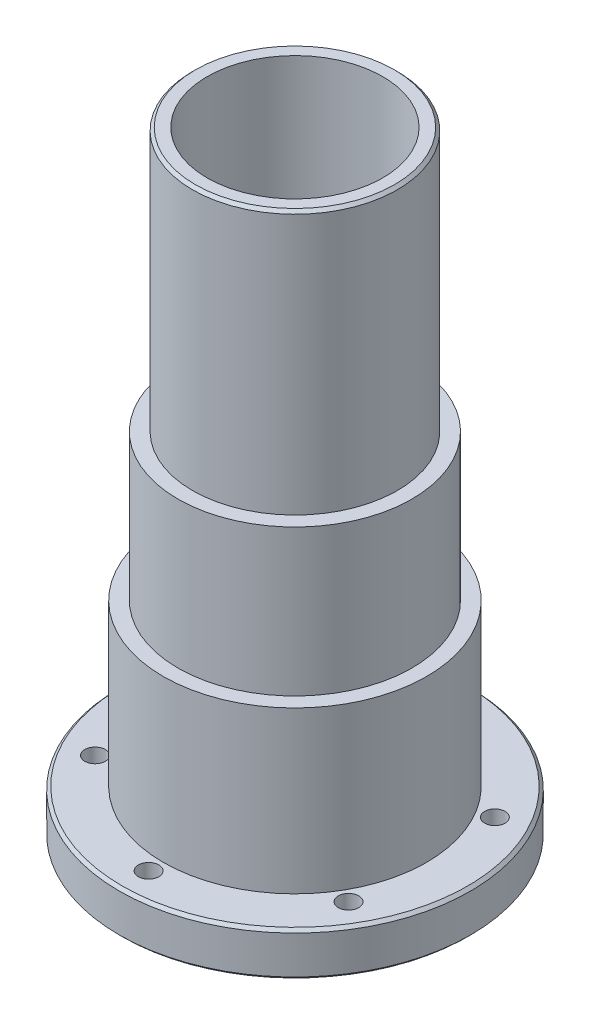
ISO-10303-21;
HEADER;
FILE_DESCRIPTION(('STEP AP214'),'2;1');
FILE_NAME('part.step','',(''),(''),'','','');
FILE_SCHEMA(('AUTOMOTIVE_DESIGN { 1 0 10303 214 1 1 1 1 }'));
ENDSEC;
DATA;
#1=APPLICATION_CONTEXT('core data for automotive mechanical design processes');
#2=APPLICATION_PROTOCOL_DEFINITION('international standard','automotive_design',2000,#1);
#3=PRODUCT_CONTEXT('',#1,'mechanical');
#4=PRODUCT('Part','Part','',(#3));
#5=PRODUCT_RELATED_PRODUCT_CATEGORY('part','',(#4));
#6=PRODUCT_DEFINITION_FORMATION('','',#4);
#7=PRODUCT_DEFINITION_CONTEXT('part definition',#1,'design');
#8=PRODUCT_DEFINITION('design','',#6,#7);
#9=PRODUCT_DEFINITION_SHAPE('','',#8);
#10=(LENGTH_UNIT() NAMED_UNIT(*) SI_UNIT(.MILLI.,.METRE.));
#11=(NAMED_UNIT(*) PLANE_ANGLE_UNIT() SI_UNIT($,.RADIAN.));
#12=(NAMED_UNIT(*) SI_UNIT($,.STERADIAN.) SOLID_ANGLE_UNIT());
#13=UNCERTAINTY_MEASURE_WITH_UNIT(LENGTH_MEASURE(1.E-05),#10,'distance_accuracy_value','');
#14=(GEOMETRIC_REPRESENTATION_CONTEXT(3) GLOBAL_UNCERTAINTY_ASSIGNED_CONTEXT((#13)) GLOBAL_UNIT_ASSIGNED_CONTEXT((#10,
#11,#12)) REPRESENTATION_CONTEXT('',''));
#15=CARTESIAN_POINT('',(0.,0.,0.));
#16=DIRECTION('',(0.,0.,1.));
#17=DIRECTION('',(1.,0.,0.));
#18=AXIS2_PLACEMENT_3D('',#15,#16,#17);
#19=CARTESIAN_POINT('',(0.,105.,17.5));
#20=DIRECTION('',(0.,1.,0.));
#21=DIRECTION('',(0.,0.,1.));
#22=AXIS2_PLACEMENT_3D('',#19,#20,#21);
#23=PLANE('',#22);
#24=CARTESIAN_POINT('',(0.,105.,0.));
#25=DIRECTION('',(0.,1.,0.));
#26=DIRECTION('',(0.,0.,1.));
#27=AXIS2_PLACEMENT_3D('',#24,#25,#26);
#28=CIRCLE('',#27,17.);
#29=CARTESIAN_POINT('',(0.,105.,17.));
#30=VERTEX_POINT('',#29);
#31=EDGE_CURVE('E44',#30,#30,#28,.T.);
#32=ORIENTED_EDGE('',*,*,#31,.T.);
#33=EDGE_LOOP('',(#32));
#34=FACE_BOUND('',#33,.T.);
#35=CARTESIAN_POINT('',(0.,105.,0.));
#36=DIRECTION('',(0.,1.,0.));
#37=DIRECTION('',(0.,0.,1.));
#38=AXIS2_PLACEMENT_3D('',#35,#36,#37);
#39=CIRCLE('',#38,15.);
#40=CARTESIAN_POINT('',(0.,105.,15.));
#41=VERTEX_POINT('',#40);
#42=EDGE_CURVE('E63',#41,#41,#39,.T.);
#43=ORIENTED_EDGE('',*,*,#42,.F.);
#44=EDGE_LOOP('',(#43));
#45=FACE_BOUND('',#44,.T.);
#46=ADVANCED_FACE('F36',(#34,#45),#23,.T.);
#47=CARTESIAN_POINT('',(0.,44.,0.));
#48=DIRECTION('',(0.,1.,0.));
#49=DIRECTION('',(0.,0.,1.));
#50=AXIS2_PLACEMENT_3D('',#47,#48,#49);
#51=CYLINDRICAL_SURFACE('',#50,15.);
#52=ORIENTED_EDGE('',*,*,#42,.T.);
#53=EDGE_LOOP('',(#52));
#54=FACE_BOUND('',#53,.T.);
#55=CARTESIAN_POINT('',(0.,0.,0.));
#56=DIRECTION('',(0.,1.,0.));
#57=DIRECTION('',(0.,0.,1.));
#58=AXIS2_PLACEMENT_3D('',#55,#56,#57);
#59=CIRCLE('',#58,15.);
#60=CARTESIAN_POINT('',(0.,0.,15.));
#61=VERTEX_POINT('',#60);
#62=EDGE_CURVE('E96',#61,#61,#59,.T.);
#63=ORIENTED_EDGE('',*,*,#62,.F.);
#64=EDGE_LOOP('',(#63));
#65=FACE_BOUND('',#64,.T.);
#66=ADVANCED_FACE('F163',(#54,#65),#51,.F.);
#67=CARTESIAN_POINT('',(0.,0.,15.));
#68=DIRECTION('',(0.,-1.,0.));
#69=DIRECTION('',(0.,0.,-1.));
#70=AXIS2_PLACEMENT_3D('',#67,#68,#69);
#71=PLANE('',#70);
#72=CARTESIAN_POINT('',(0.,0.,0.));
#73=DIRECTION('',(0.,-1.,0.));
#74=DIRECTION('',(0.,0.,-1.));
#75=AXIS2_PLACEMENT_3D('',#72,#73,#74);
#76=CIRCLE('',#75,29.5);
#77=CARTESIAN_POINT('',(0.,0.,-29.5));
#78=VERTEX_POINT('',#77);
#79=EDGE_CURVE('E48',#78,#78,#76,.T.);
#80=ORIENTED_EDGE('',*,*,#79,.T.);
#81=EDGE_LOOP('',(#80));
#82=FACE_BOUND('',#81,.T.);
#83=CARTESIAN_POINT('',(-21.6506350946108,0.,12.5000000000003));
#84=DIRECTION('',(0.,-1.,0.));
#85=DIRECTION('',(0.,0.,-1.));
#86=AXIS2_PLACEMENT_3D('',#83,#84,#85);
#87=CIRCLE('',#86,3.);
#88=CARTESIAN_POINT('',(-21.6506350946108,0.,9.50000000000025));
#89=VERTEX_POINT('',#88);
#90=EDGE_CURVE('E153',#89,#89,#87,.T.);
#91=ORIENTED_EDGE('',*,*,#90,.F.);
#92=EDGE_LOOP('',(#91));
#93=FACE_BOUND('',#92,.T.);
#94=CARTESIAN_POINT('',(-21.6506350946111,0.,-12.4999999999998));
#95=DIRECTION('',(0.,-1.,0.));
#96=DIRECTION('',(0.,0.,-1.));
#97=AXIS2_PLACEMENT_3D('',#94,#95,#96);
#98=CIRCLE('',#97,3.);
#99=CARTESIAN_POINT('',(-21.6506350946111,0.,-15.4999999999998));
#100=VERTEX_POINT('',#99);
#101=EDGE_CURVE('E67',#100,#100,#98,.T.);
#102=ORIENTED_EDGE('',*,*,#101,.F.);
#103=EDGE_LOOP('',(#102));
#104=FACE_BOUND('',#103,.T.);
#105=CARTESIAN_POINT('',(0.,0.,-25.));
#106=DIRECTION('',(0.,-1.,0.));
#107=DIRECTION('',(0.,0.,-1.));
#108=AXIS2_PLACEMENT_3D('',#105,#106,#107);
#109=CIRCLE('',#108,3.);
#110=CARTESIAN_POINT('',(0.,0.,-28.));
#111=VERTEX_POINT('',#110);
#112=EDGE_CURVE('E72',#111,#111,#109,.T.);
#113=ORIENTED_EDGE('',*,*,#112,.F.);
#114=EDGE_LOOP('',(#113));
#115=FACE_BOUND('',#114,.T.);
#116=CARTESIAN_POINT('',(21.6506350946109,0.,-12.5000000000001));
#117=DIRECTION('',(0.,-1.,0.));
#118=DIRECTION('',(0.,0.,-1.));
#119=AXIS2_PLACEMENT_3D('',#116,#117,#118);
#120=CIRCLE('',#119,3.);
#121=CARTESIAN_POINT('',(21.6506350946109,0.,-15.5000000000001));
#122=VERTEX_POINT('',#121);
#123=EDGE_CURVE('E77',#122,#122,#120,.T.);
#124=ORIENTED_EDGE('',*,*,#123,.F.);
#125=EDGE_LOOP('',(#124));
#126=FACE_BOUND('',#125,.T.);
#127=CARTESIAN_POINT('',(21.650635094611,0.,12.5));
#128=DIRECTION('',(0.,-1.,0.));
#129=DIRECTION('',(0.,0.,-1.));
#130=AXIS2_PLACEMENT_3D('',#127,#128,#129);
#131=CIRCLE('',#130,3.);
#132=CARTESIAN_POINT('',(21.650635094611,0.,9.49999999999995));
#133=VERTEX_POINT('',#132);
#134=EDGE_CURVE('E82',#133,#133,#131,.T.);
#135=ORIENTED_EDGE('',*,*,#134,.F.);
#136=EDGE_LOOP('',(#135));
#137=FACE_BOUND('',#136,.T.);
#138=CARTESIAN_POINT('',(0.,0.,25.));
#139=DIRECTION('',(0.,-1.,0.));
#140=DIRECTION('',(0.,0.,-1.));
#141=AXIS2_PLACEMENT_3D('',#138,#139,#140);
#142=CIRCLE('',#141,3.);
#143=CARTESIAN_POINT('',(0.,0.,22.));
#144=VERTEX_POINT('',#143);
#145=EDGE_CURVE('E87',#144,#144,#142,.T.);
#146=ORIENTED_EDGE('',*,*,#145,.F.);
#147=EDGE_LOOP('',(#146));
#148=FACE_BOUND('',#147,.T.);
#149=ORIENTED_EDGE('',*,*,#62,.T.);
#150=EDGE_LOOP('',(#149));
#151=FACE_BOUND('',#150,.T.);
#152=ADVANCED_FACE('F159',(#82,#93,#104,#115,#126,#137,#148,#151),#71,.T.);
#153=CARTESIAN_POINT('',(0.,44.,0.));
#154=DIRECTION('',(0.,1.,0.));
#155=DIRECTION('',(0.,0.,1.));
#156=AXIS2_PLACEMENT_3D('',#153,#154,#155);
#157=CYLINDRICAL_SURFACE('',#156,30.);
#158=CARTESIAN_POINT('',(0.,7.00000000000003,0.));
#159=DIRECTION('',(0.,1.,0.));
#160=DIRECTION('',(0.,0.,1.));
#161=AXIS2_PLACEMENT_3D('',#158,#159,#160);
#162=CIRCLE('',#161,30.);
#163=CARTESIAN_POINT('',(0.,7.00000000000003,30.));
#164=VERTEX_POINT('',#163);
#165=EDGE_CURVE('E52',#164,#164,#162,.F.);
#166=ORIENTED_EDGE('',*,*,#165,.T.);
#167=EDGE_LOOP('',(#166));
#168=FACE_BOUND('',#167,.T.);
#169=CARTESIAN_POINT('',(0.,0.5,0.));
#170=DIRECTION('',(0.,-1.,0.));
#171=DIRECTION('',(0.,0.,-1.));
#172=AXIS2_PLACEMENT_3D('',#169,#170,#171);
#173=CIRCLE('',#172,30.);
#174=CARTESIAN_POINT('',(0.,0.5,-30.));
#175=VERTEX_POINT('',#174);
#176=EDGE_CURVE('E57',#175,#175,#173,.F.);
#177=ORIENTED_EDGE('',*,*,#176,.T.);
#178=EDGE_LOOP('',(#177));
#179=FACE_BOUND('',#178,.T.);
#180=ADVANCED_FACE('F162',(#168,#179),#157,.T.);
#181=CARTESIAN_POINT('',(0.,7.5,30.));
#182=DIRECTION('',(0.,1.,0.));
#183=DIRECTION('',(0.,0.,1.));
#184=AXIS2_PLACEMENT_3D('',#181,#182,#183);
#185=PLANE('',#184);
#186=CARTESIAN_POINT('',(0.,7.5,0.));
#187=DIRECTION('',(0.,1.,0.));
#188=DIRECTION('',(0.,0.,1.));
#189=AXIS2_PLACEMENT_3D('',#186,#187,#188);
#190=CIRCLE('',#189,29.5);
#191=CARTESIAN_POINT('',(0.,7.5,29.5));
#192=VERTEX_POINT('',#191);
#193=EDGE_CURVE('E60',#192,#192,#190,.T.);
#194=ORIENTED_EDGE('',*,*,#193,.T.);
#195=EDGE_LOOP('',(#194));
#196=FACE_BOUND('',#195,.T.);
#197=CARTESIAN_POINT('',(-21.6506350946108,7.5,12.5000000000003));
#198=DIRECTION('',(0.,1.,0.));
#199=DIRECTION('',(0.,0.,1.));
#200=AXIS2_PLACEMENT_3D('',#197,#198,#199);
#201=CIRCLE('',#200,1.74999999999999);
#202=CARTESIAN_POINT('',(-21.6506350946108,7.5,14.2500000000002));
#203=VERTEX_POINT('',#202);
#204=EDGE_CURVE('E64',#203,#203,#201,.T.);
#205=ORIENTED_EDGE('',*,*,#204,.F.);
#206=EDGE_LOOP('',(#205));
#207=FACE_BOUND('',#206,.T.);
#208=CARTESIAN_POINT('',(-21.6506350946111,7.5,-12.4999999999998));
#209=DIRECTION('',(0.,1.,0.));
#210=DIRECTION('',(0.,0.,1.));
#211=AXIS2_PLACEMENT_3D('',#208,#209,#210);
#212=CIRCLE('',#211,1.74999999999999);
#213=CARTESIAN_POINT('',(-21.6506350946111,7.5,-10.7499999999998));
#214=VERTEX_POINT('',#213);
#215=EDGE_CURVE('E69',#214,#214,#212,.T.);
#216=ORIENTED_EDGE('',*,*,#215,.F.);
#217=EDGE_LOOP('',(#216));
#218=FACE_BOUND('',#217,.T.);
#219=CARTESIAN_POINT('',(0.,7.5,-25.));
#220=DIRECTION('',(0.,1.,0.));
#221=DIRECTION('',(0.,0.,1.));
#222=AXIS2_PLACEMENT_3D('',#219,#220,#221);
#223=CIRCLE('',#222,1.74999999999999);
#224=CARTESIAN_POINT('',(0.,7.5,-23.25));
#225=VERTEX_POINT('',#224);
#226=EDGE_CURVE('E74',#225,#225,#223,.T.);
#227=ORIENTED_EDGE('',*,*,#226,.F.);
#228=EDGE_LOOP('',(#227));
#229=FACE_BOUND('',#228,.T.);
#230=CARTESIAN_POINT('',(21.6506350946109,7.5,-12.5000000000001));
#231=DIRECTION('',(0.,1.,0.));
#232=DIRECTION('',(0.,0.,1.));
#233=AXIS2_PLACEMENT_3D('',#230,#231,#232);
#234=CIRCLE('',#233,1.74999999999999);
#235=CARTESIAN_POINT('',(21.6506350946109,7.5,-10.7500000000001));
#236=VERTEX_POINT('',#235);
#237=EDGE_CURVE('E79',#236,#236,#234,.T.);
#238=ORIENTED_EDGE('',*,*,#237,.F.);
#239=EDGE_LOOP('',(#238));
#240=FACE_BOUND('',#239,.T.);
#241=CARTESIAN_POINT('',(21.650635094611,7.5,12.5));
#242=DIRECTION('',(0.,1.,0.));
#243=DIRECTION('',(0.,0.,1.));
#244=AXIS2_PLACEMENT_3D('',#241,#242,#243);
#245=CIRCLE('',#244,1.74999999999999);
#246=CARTESIAN_POINT('',(21.650635094611,7.5,14.2499999999999));
#247=VERTEX_POINT('',#246);
#248=EDGE_CURVE('E84',#247,#247,#245,.T.);
#249=ORIENTED_EDGE('',*,*,#248,.F.);
#250=EDGE_LOOP('',(#249));
#251=FACE_BOUND('',#250,.T.);
#252=CARTESIAN_POINT('',(0.,7.5,25.));
#253=DIRECTION('',(0.,1.,0.));
#254=DIRECTION('',(0.,0.,1.));
#255=AXIS2_PLACEMENT_3D('',#252,#253,#254);
#256=CIRCLE('',#255,1.74999999999999);
#257=CARTESIAN_POINT('',(0.,7.5,26.75));
#258=VERTEX_POINT('',#257);
#259=EDGE_CURVE('E89',#258,#258,#256,.T.);
#260=ORIENTED_EDGE('',*,*,#259,.F.);
#261=EDGE_LOOP('',(#260));
#262=FACE_BOUND('',#261,.T.);
#263=CARTESIAN_POINT('',(0.,7.5,0.));
#264=DIRECTION('',(0.,1.,0.));
#265=DIRECTION('',(0.,0.,1.));
#266=AXIS2_PLACEMENT_3D('',#263,#264,#265);
#267=CIRCLE('',#266,22.5);
#268=CARTESIAN_POINT('',(0.,7.5,22.5));
#269=VERTEX_POINT('',#268);
#270=EDGE_CURVE('E99',#269,#269,#267,.T.);
#271=ORIENTED_EDGE('',*,*,#270,.F.);
#272=EDGE_LOOP('',(#271));
#273=FACE_BOUND('',#272,.T.);
#274=ADVANCED_FACE('F208',(#196,#207,#218,#229,#240,#251,#262,#273),#185,.T.);
#275=CARTESIAN_POINT('',(0.,44.,0.));
#276=DIRECTION('',(0.,1.,0.));
#277=DIRECTION('',(0.,0.,1.));
#278=AXIS2_PLACEMENT_3D('',#275,#276,#277);
#279=CYLINDRICAL_SURFACE('',#278,22.5);
#280=ORIENTED_EDGE('',*,*,#270,.T.);
#281=EDGE_LOOP('',(#280));
#282=FACE_BOUND('',#281,.T.);
#283=CARTESIAN_POINT('',(0.,35.,0.));
#284=DIRECTION('',(0.,1.,0.));
#285=DIRECTION('',(0.,0.,1.));
#286=AXIS2_PLACEMENT_3D('',#283,#284,#285);
#287=CIRCLE('',#286,22.5);
#288=CARTESIAN_POINT('',(0.,35.,22.5));
#289=VERTEX_POINT('',#288);
#290=EDGE_CURVE('E102',#289,#289,#287,.T.);
#291=ORIENTED_EDGE('',*,*,#290,.F.);
#292=EDGE_LOOP('',(#291));
#293=FACE_BOUND('',#292,.T.);
#294=ADVANCED_FACE('F213',(#282,#293),#279,.T.);
#295=CARTESIAN_POINT('',(0.,35.,22.5));
#296=DIRECTION('',(0.,1.,0.));
#297=DIRECTION('',(0.,0.,1.));
#298=AXIS2_PLACEMENT_3D('',#295,#296,#297);
#299=PLANE('',#298);
#300=ORIENTED_EDGE('',*,*,#290,.T.);
#301=EDGE_LOOP('',(#300));
#302=FACE_BOUND('',#301,.T.);
#303=CARTESIAN_POINT('',(0.,35.,0.));
#304=DIRECTION('',(0.,1.,0.));
#305=DIRECTION('',(0.,0.,1.));
#306=AXIS2_PLACEMENT_3D('',#303,#304,#305);
#307=CIRCLE('',#306,20.);
#308=CARTESIAN_POINT('',(0.,35.,20.));
#309=VERTEX_POINT('',#308);
#310=EDGE_CURVE('E105',#309,#309,#307,.T.);
#311=ORIENTED_EDGE('',*,*,#310,.F.);
#312=EDGE_LOOP('',(#311));
#313=FACE_BOUND('',#312,.T.);
#314=ADVANCED_FACE('F219',(#302,#313),#299,.T.);
#315=CARTESIAN_POINT('',(0.,44.,0.));
#316=DIRECTION('',(0.,1.,0.));
#317=DIRECTION('',(0.,0.,1.));
#318=AXIS2_PLACEMENT_3D('',#315,#316,#317);
#319=CYLINDRICAL_SURFACE('',#318,20.);
#320=ORIENTED_EDGE('',*,*,#310,.T.);
#321=EDGE_LOOP('',(#320));
#322=FACE_BOUND('',#321,.T.);
#323=CARTESIAN_POINT('',(0.,60.,0.));
#324=DIRECTION('',(0.,1.,0.));
#325=DIRECTION('',(0.,0.,1.));
#326=AXIS2_PLACEMENT_3D('',#323,#324,#325);
#327=CIRCLE('',#326,20.);
#328=CARTESIAN_POINT('',(0.,60.,20.));
#329=VERTEX_POINT('',#328);
#330=EDGE_CURVE('E108',#329,#329,#327,.T.);
#331=ORIENTED_EDGE('',*,*,#330,.F.);
#332=EDGE_LOOP('',(#331));
#333=FACE_BOUND('',#332,.T.);
#334=ADVANCED_FACE('F223',(#322,#333),#319,.T.);
#335=CARTESIAN_POINT('',(0.,60.,20.));
#336=DIRECTION('',(0.,1.,0.));
#337=DIRECTION('',(0.,0.,1.));
#338=AXIS2_PLACEMENT_3D('',#335,#336,#337);
#339=PLANE('',#338);
#340=ORIENTED_EDGE('',*,*,#330,.T.);
#341=EDGE_LOOP('',(#340));
#342=FACE_BOUND('',#341,.T.);
#343=CARTESIAN_POINT('',(0.,60.,0.));
#344=DIRECTION('',(0.,1.,0.));
#345=DIRECTION('',(0.,0.,1.));
#346=AXIS2_PLACEMENT_3D('',#343,#344,#345);
#347=CIRCLE('',#346,17.5);
#348=CARTESIAN_POINT('',(0.,60.,17.5));
#349=VERTEX_POINT('',#348);
#350=EDGE_CURVE('E92',#349,#349,#347,.T.);
#351=ORIENTED_EDGE('',*,*,#350,.F.);
#352=EDGE_LOOP('',(#351));
#353=FACE_BOUND('',#352,.T.);
#354=ADVANCED_FACE('F227',(#342,#353),#339,.T.);
#355=CARTESIAN_POINT('',(0.,44.,0.));
#356=DIRECTION('',(0.,1.,0.));
#357=DIRECTION('',(0.,0.,1.));
#358=AXIS2_PLACEMENT_3D('',#355,#356,#357);
#359=CYLINDRICAL_SURFACE('',#358,17.5);
#360=CARTESIAN_POINT('',(0.,104.5,0.));
#361=DIRECTION('',(0.,1.,0.));
#362=DIRECTION('',(0.,0.,1.));
#363=AXIS2_PLACEMENT_3D('',#360,#361,#362);
#364=CIRCLE('',#363,17.5);
#365=CARTESIAN_POINT('',(0.,104.5,17.5));
#366=VERTEX_POINT('',#365);
#367=EDGE_CURVE('E10',#366,#366,#364,.F.);
#368=ORIENTED_EDGE('',*,*,#367,.T.);
#369=EDGE_LOOP('',(#368));
#370=FACE_BOUND('',#369,.T.);
#371=ORIENTED_EDGE('',*,*,#350,.T.);
#372=EDGE_LOOP('',(#371));
#373=FACE_BOUND('',#372,.T.);
#374=ADVANCED_FACE('F231',(#370,#373),#359,.T.);
#375=CARTESIAN_POINT('',(0.,0.,25.));
#376=DIRECTION('',(0.,-1.,0.));
#377=DIRECTION('',(0.,0.,-1.));
#378=AXIS2_PLACEMENT_3D('',#375,#376,#377);
#379=CYLINDRICAL_SURFACE('',#378,1.74999999999999);
#380=ORIENTED_EDGE('',*,*,#259,.T.);
#381=EDGE_LOOP('',(#380));
#382=FACE_BOUND('',#381,.T.);
#383=CARTESIAN_POINT('',(0.,4.,25.));
#384=DIRECTION('',(0.,-1.,0.));
#385=DIRECTION('',(0.,0.,-1.));
#386=AXIS2_PLACEMENT_3D('',#383,#384,#385);
#387=CIRCLE('',#386,1.75000000000001);
#388=CARTESIAN_POINT('',(0.,4.,23.25));
#389=VERTEX_POINT('',#388);
#390=EDGE_CURVE('E93',#389,#389,#387,.T.);
#391=ORIENTED_EDGE('',*,*,#390,.T.);
#392=EDGE_LOOP('',(#391));
#393=FACE_BOUND('',#392,.T.);
#394=ADVANCED_FACE('F235',(#382,#393),#379,.F.);
#395=CARTESIAN_POINT('',(1.75000000000001,4.,25.));
#396=DIRECTION('',(0.,1.,0.));
#397=DIRECTION('',(0.,0.,1.));
#398=AXIS2_PLACEMENT_3D('',#395,#396,#397);
#399=PLANE('',#398);
#400=ORIENTED_EDGE('',*,*,#390,.F.);
#401=EDGE_LOOP('',(#400));
#402=FACE_BOUND('',#401,.T.);
#403=CARTESIAN_POINT('',(0.,4.,25.));
#404=DIRECTION('',(0.,-1.,0.));
#405=DIRECTION('',(0.,0.,-1.));
#406=AXIS2_PLACEMENT_3D('',#403,#404,#405);
#407=CIRCLE('',#406,3.);
#408=CARTESIAN_POINT('',(0.,4.,22.));
#409=VERTEX_POINT('',#408);
#410=EDGE_CURVE('E115',#409,#409,#407,.T.);
#411=ORIENTED_EDGE('',*,*,#410,.T.);
#412=EDGE_LOOP('',(#411));
#413=FACE_BOUND('',#412,.T.);
#414=ADVANCED_FACE('F238',(#402,#413),#399,.F.);
#415=CARTESIAN_POINT('',(0.,0.,25.));
#416=DIRECTION('',(0.,-1.,0.));
#417=DIRECTION('',(0.,0.,-1.));
#418=AXIS2_PLACEMENT_3D('',#415,#416,#417);
#419=CYLINDRICAL_SURFACE('',#418,3.);
#420=ORIENTED_EDGE('',*,*,#410,.F.);
#421=EDGE_LOOP('',(#420));
#422=FACE_BOUND('',#421,.T.);
#423=ORIENTED_EDGE('',*,*,#145,.T.);
#424=EDGE_LOOP('',(#423));
#425=FACE_BOUND('',#424,.T.);
#426=ADVANCED_FACE('F242',(#422,#425),#419,.F.);
#427=CARTESIAN_POINT('',(21.650635094611,0.,12.5));
#428=DIRECTION('',(0.,-1.,0.));
#429=DIRECTION('',(0.,0.,-1.));
#430=AXIS2_PLACEMENT_3D('',#427,#428,#429);
#431=CYLINDRICAL_SURFACE('',#430,1.74999999999999);
#432=ORIENTED_EDGE('',*,*,#248,.T.);
#433=EDGE_LOOP('',(#432));
#434=FACE_BOUND('',#433,.T.);
#435=CARTESIAN_POINT('',(21.650635094611,4.,12.5));
#436=DIRECTION('',(0.,-1.,0.));
#437=DIRECTION('',(0.,0.,-1.));
#438=AXIS2_PLACEMENT_3D('',#435,#436,#437);
#439=CIRCLE('',#438,1.75000000000001);
#440=CARTESIAN_POINT('',(21.650635094611,4.,10.7499999999999));
#441=VERTEX_POINT('',#440);
#442=EDGE_CURVE('E88',#441,#441,#439,.T.);
#443=ORIENTED_EDGE('',*,*,#442,.T.);
#444=EDGE_LOOP('',(#443));
#445=FACE_BOUND('',#444,.T.);
#446=ADVANCED_FACE('F246',(#434,#445),#431,.F.);
#447=CARTESIAN_POINT('',(23.400635094611,4.,12.5));
#448=DIRECTION('',(0.,1.,0.));
#449=DIRECTION('',(0.,0.,1.));
#450=AXIS2_PLACEMENT_3D('',#447,#448,#449);
#451=PLANE('',#450);
#452=ORIENTED_EDGE('',*,*,#442,.F.);
#453=EDGE_LOOP('',(#452));
#454=FACE_BOUND('',#453,.T.);
#455=CARTESIAN_POINT('',(21.650635094611,4.,12.5));
#456=DIRECTION('',(0.,-1.,0.));
#457=DIRECTION('',(0.,0.,-1.));
#458=AXIS2_PLACEMENT_3D('',#455,#456,#457);
#459=CIRCLE('',#458,3.);
#460=CARTESIAN_POINT('',(21.650635094611,4.,9.49999999999995));
#461=VERTEX_POINT('',#460);
#462=EDGE_CURVE('E122',#461,#461,#459,.T.);
#463=ORIENTED_EDGE('',*,*,#462,.T.);
#464=EDGE_LOOP('',(#463));
#465=FACE_BOUND('',#464,.T.);
#466=ADVANCED_FACE('F250',(#454,#465),#451,.F.);
#467=CARTESIAN_POINT('',(21.650635094611,0.,12.5));
#468=DIRECTION('',(0.,-1.,0.));
#469=DIRECTION('',(0.,0.,-1.));
#470=AXIS2_PLACEMENT_3D('',#467,#468,#469);
#471=CYLINDRICAL_SURFACE('',#470,3.);
#472=ORIENTED_EDGE('',*,*,#462,.F.);
#473=EDGE_LOOP('',(#472));
#474=FACE_BOUND('',#473,.T.);
#475=ORIENTED_EDGE('',*,*,#134,.T.);
#476=EDGE_LOOP('',(#475));
#477=FACE_BOUND('',#476,.T.);
#478=ADVANCED_FACE('F254',(#474,#477),#471,.F.);
#479=CARTESIAN_POINT('',(21.6506350946109,0.,-12.5000000000001));
#480=DIRECTION('',(0.,-1.,0.));
#481=DIRECTION('',(0.,0.,-1.));
#482=AXIS2_PLACEMENT_3D('',#479,#480,#481);
#483=CYLINDRICAL_SURFACE('',#482,1.74999999999999);
#484=ORIENTED_EDGE('',*,*,#237,.T.);
#485=EDGE_LOOP('',(#484));
#486=FACE_BOUND('',#485,.T.);
#487=CARTESIAN_POINT('',(21.6506350946109,4.,-12.5000000000001));
#488=DIRECTION('',(0.,-1.,0.));
#489=DIRECTION('',(0.,0.,-1.));
#490=AXIS2_PLACEMENT_3D('',#487,#488,#489);
#491=CIRCLE('',#490,1.75000000000001);
#492=CARTESIAN_POINT('',(21.6506350946109,4.,-14.2500000000001));
#493=VERTEX_POINT('',#492);
#494=EDGE_CURVE('E83',#493,#493,#491,.T.);
#495=ORIENTED_EDGE('',*,*,#494,.T.);
#496=EDGE_LOOP('',(#495));
#497=FACE_BOUND('',#496,.T.);
#498=ADVANCED_FACE('F258',(#486,#497),#483,.F.);
#499=CARTESIAN_POINT('',(23.4006350946109,4.,-12.5000000000001));
#500=DIRECTION('',(0.,1.,0.));
#501=DIRECTION('',(0.,0.,1.));
#502=AXIS2_PLACEMENT_3D('',#499,#500,#501);
#503=PLANE('',#502);
#504=ORIENTED_EDGE('',*,*,#494,.F.);
#505=EDGE_LOOP('',(#504));
#506=FACE_BOUND('',#505,.T.);
#507=CARTESIAN_POINT('',(21.6506350946109,4.,-12.5000000000001));
#508=DIRECTION('',(0.,-1.,0.));
#509=DIRECTION('',(0.,0.,-1.));
#510=AXIS2_PLACEMENT_3D('',#507,#508,#509);
#511=CIRCLE('',#510,3.);
#512=CARTESIAN_POINT('',(21.6506350946109,4.,-15.5000000000001));
#513=VERTEX_POINT('',#512);
#514=EDGE_CURVE('E129',#513,#513,#511,.T.);
#515=ORIENTED_EDGE('',*,*,#514,.T.);
#516=EDGE_LOOP('',(#515));
#517=FACE_BOUND('',#516,.T.);
#518=ADVANCED_FACE('F262',(#506,#517),#503,.F.);
#519=CARTESIAN_POINT('',(21.6506350946109,0.,-12.5000000000001));
#520=DIRECTION('',(0.,-1.,0.));
#521=DIRECTION('',(0.,0.,-1.));
#522=AXIS2_PLACEMENT_3D('',#519,#520,#521);
#523=CYLINDRICAL_SURFACE('',#522,3.);
#524=ORIENTED_EDGE('',*,*,#514,.F.);
#525=EDGE_LOOP('',(#524));
#526=FACE_BOUND('',#525,.T.);
#527=ORIENTED_EDGE('',*,*,#123,.T.);
#528=EDGE_LOOP('',(#527));
#529=FACE_BOUND('',#528,.T.);
#530=ADVANCED_FACE('F266',(#526,#529),#523,.F.);
#531=CARTESIAN_POINT('',(0.,0.,-25.));
#532=DIRECTION('',(0.,-1.,0.));
#533=DIRECTION('',(0.,0.,-1.));
#534=AXIS2_PLACEMENT_3D('',#531,#532,#533);
#535=CYLINDRICAL_SURFACE('',#534,1.74999999999999);
#536=ORIENTED_EDGE('',*,*,#226,.T.);
#537=EDGE_LOOP('',(#536));
#538=FACE_BOUND('',#537,.T.);
#539=CARTESIAN_POINT('',(0.,4.,-25.));
#540=DIRECTION('',(0.,-1.,0.));
#541=DIRECTION('',(0.,0.,-1.));
#542=AXIS2_PLACEMENT_3D('',#539,#540,#541);
#543=CIRCLE('',#542,1.75000000000001);
#544=CARTESIAN_POINT('',(0.,4.,-26.75));
#545=VERTEX_POINT('',#544);
#546=EDGE_CURVE('E78',#545,#545,#543,.T.);
#547=ORIENTED_EDGE('',*,*,#546,.T.);
#548=EDGE_LOOP('',(#547));
#549=FACE_BOUND('',#548,.T.);
#550=ADVANCED_FACE('F270',(#538,#549),#535,.F.);
#551=CARTESIAN_POINT('',(1.75000000000001,4.,-25.));
#552=DIRECTION('',(0.,1.,0.));
#553=DIRECTION('',(0.,0.,1.));
#554=AXIS2_PLACEMENT_3D('',#551,#552,#553);
#555=PLANE('',#554);
#556=ORIENTED_EDGE('',*,*,#546,.F.);
#557=EDGE_LOOP('',(#556));
#558=FACE_BOUND('',#557,.T.);
#559=CARTESIAN_POINT('',(0.,4.,-25.));
#560=DIRECTION('',(0.,-1.,0.));
#561=DIRECTION('',(0.,0.,-1.));
#562=AXIS2_PLACEMENT_3D('',#559,#560,#561);
#563=CIRCLE('',#562,3.);
#564=CARTESIAN_POINT('',(0.,4.,-28.));
#565=VERTEX_POINT('',#564);
#566=EDGE_CURVE('E136',#565,#565,#563,.T.);
#567=ORIENTED_EDGE('',*,*,#566,.T.);
#568=EDGE_LOOP('',(#567));
#569=FACE_BOUND('',#568,.T.);
#570=ADVANCED_FACE('F274',(#558,#569),#555,.F.);
#571=CARTESIAN_POINT('',(0.,0.,-25.));
#572=DIRECTION('',(0.,-1.,0.));
#573=DIRECTION('',(0.,0.,-1.));
#574=AXIS2_PLACEMENT_3D('',#571,#572,#573);
#575=CYLINDRICAL_SURFACE('',#574,3.);
#576=ORIENTED_EDGE('',*,*,#566,.F.);
#577=EDGE_LOOP('',(#576));
#578=FACE_BOUND('',#577,.T.);
#579=ORIENTED_EDGE('',*,*,#112,.T.);
#580=EDGE_LOOP('',(#579));
#581=FACE_BOUND('',#580,.T.);
#582=ADVANCED_FACE('F278',(#578,#581),#575,.F.);
#583=CARTESIAN_POINT('',(-21.6506350946111,0.,-12.4999999999998));
#584=DIRECTION('',(0.,-1.,0.));
#585=DIRECTION('',(0.,0.,-1.));
#586=AXIS2_PLACEMENT_3D('',#583,#584,#585);
#587=CYLINDRICAL_SURFACE('',#586,1.74999999999999);
#588=ORIENTED_EDGE('',*,*,#215,.T.);
#589=EDGE_LOOP('',(#588));
#590=FACE_BOUND('',#589,.T.);
#591=CARTESIAN_POINT('',(-21.6506350946111,4.,-12.4999999999998));
#592=DIRECTION('',(0.,-1.,0.));
#593=DIRECTION('',(0.,0.,-1.));
#594=AXIS2_PLACEMENT_3D('',#591,#592,#593);
#595=CIRCLE('',#594,1.75000000000001);
#596=CARTESIAN_POINT('',(-21.6506350946111,4.,-14.2499999999998));
#597=VERTEX_POINT('',#596);
#598=EDGE_CURVE('E73',#597,#597,#595,.T.);
#599=ORIENTED_EDGE('',*,*,#598,.T.);
#600=EDGE_LOOP('',(#599));
#601=FACE_BOUND('',#600,.T.);
#602=ADVANCED_FACE('F282',(#590,#601),#587,.F.);
#603=CARTESIAN_POINT('',(-19.9006350946111,4.,-12.4999999999998));
#604=DIRECTION('',(0.,1.,0.));
#605=DIRECTION('',(0.,0.,1.));
#606=AXIS2_PLACEMENT_3D('',#603,#604,#605);
#607=PLANE('',#606);
#608=ORIENTED_EDGE('',*,*,#598,.F.);
#609=EDGE_LOOP('',(#608));
#610=FACE_BOUND('',#609,.T.);
#611=CARTESIAN_POINT('',(-21.6506350946111,4.,-12.4999999999998));
#612=DIRECTION('',(0.,-1.,0.));
#613=DIRECTION('',(0.,0.,-1.));
#614=AXIS2_PLACEMENT_3D('',#611,#612,#613);
#615=CIRCLE('',#614,3.);
#616=CARTESIAN_POINT('',(-21.6506350946111,4.,-15.4999999999998));
#617=VERTEX_POINT('',#616);
#618=EDGE_CURVE('E143',#617,#617,#615,.T.);
#619=ORIENTED_EDGE('',*,*,#618,.T.);
#620=EDGE_LOOP('',(#619));
#621=FACE_BOUND('',#620,.T.);
#622=ADVANCED_FACE('F286',(#610,#621),#607,.F.);
#623=CARTESIAN_POINT('',(-21.6506350946111,0.,-12.4999999999998));
#624=DIRECTION('',(0.,-1.,0.));
#625=DIRECTION('',(0.,0.,-1.));
#626=AXIS2_PLACEMENT_3D('',#623,#624,#625);
#627=CYLINDRICAL_SURFACE('',#626,3.);
#628=ORIENTED_EDGE('',*,*,#618,.F.);
#629=EDGE_LOOP('',(#628));
#630=FACE_BOUND('',#629,.T.);
#631=ORIENTED_EDGE('',*,*,#101,.T.);
#632=EDGE_LOOP('',(#631));
#633=FACE_BOUND('',#632,.T.);
#634=ADVANCED_FACE('F290',(#630,#633),#627,.F.);
#635=CARTESIAN_POINT('',(-21.6506350946108,0.,12.5000000000003));
#636=DIRECTION('',(0.,-1.,0.));
#637=DIRECTION('',(0.,0.,-1.));
#638=AXIS2_PLACEMENT_3D('',#635,#636,#637);
#639=CYLINDRICAL_SURFACE('',#638,1.74999999999999);
#640=ORIENTED_EDGE('',*,*,#204,.T.);
#641=EDGE_LOOP('',(#640));
#642=FACE_BOUND('',#641,.T.);
#643=CARTESIAN_POINT('',(-21.6506350946108,4.,12.5000000000003));
#644=DIRECTION('',(0.,-1.,0.));
#645=DIRECTION('',(0.,0.,-1.));
#646=AXIS2_PLACEMENT_3D('',#643,#644,#645);
#647=CIRCLE('',#646,1.75000000000001);
#648=CARTESIAN_POINT('',(-21.6506350946108,4.,10.7500000000002));
#649=VERTEX_POINT('',#648);
#650=EDGE_CURVE('E68',#649,#649,#647,.T.);
#651=ORIENTED_EDGE('',*,*,#650,.T.);
#652=EDGE_LOOP('',(#651));
#653=FACE_BOUND('',#652,.T.);
#654=ADVANCED_FACE('F294',(#642,#653),#639,.F.);
#655=CARTESIAN_POINT('',(-19.9006350946108,4.,12.5000000000003));
#656=DIRECTION('',(0.,1.,0.));
#657=DIRECTION('',(0.,0.,1.));
#658=AXIS2_PLACEMENT_3D('',#655,#656,#657);
#659=PLANE('',#658);
#660=ORIENTED_EDGE('',*,*,#650,.F.);
#661=EDGE_LOOP('',(#660));
#662=FACE_BOUND('',#661,.T.);
#663=CARTESIAN_POINT('',(-21.6506350946108,4.,12.5000000000003));
#664=DIRECTION('',(0.,-1.,0.));
#665=DIRECTION('',(0.,0.,-1.));
#666=AXIS2_PLACEMENT_3D('',#663,#664,#665);
#667=CIRCLE('',#666,3.);
#668=CARTESIAN_POINT('',(-21.6506350946108,4.,9.50000000000025));
#669=VERTEX_POINT('',#668);
#670=EDGE_CURVE('E150',#669,#669,#667,.T.);
#671=ORIENTED_EDGE('',*,*,#670,.T.);
#672=EDGE_LOOP('',(#671));
#673=FACE_BOUND('',#672,.T.);
#674=ADVANCED_FACE('F298',(#662,#673),#659,.F.);
#675=CARTESIAN_POINT('',(-21.6506350946108,0.,12.5000000000003));
#676=DIRECTION('',(0.,-1.,0.));
#677=DIRECTION('',(0.,0.,-1.));
#678=AXIS2_PLACEMENT_3D('',#675,#676,#677);
#679=CYLINDRICAL_SURFACE('',#678,3.);
#680=ORIENTED_EDGE('',*,*,#670,.F.);
#681=EDGE_LOOP('',(#680));
#682=FACE_BOUND('',#681,.T.);
#683=ORIENTED_EDGE('',*,*,#90,.T.);
#684=EDGE_LOOP('',(#683));
#685=FACE_BOUND('',#684,.T.);
#686=ADVANCED_FACE('F157',(#682,#685),#679,.F.);
#687=CARTESIAN_POINT('',(0.,7.5,0.));
#688=DIRECTION('',(0.,-1.,0.));
#689=DIRECTION('',(0.,0.,-1.));
#690=AXIS2_PLACEMENT_3D('',#687,#688,#689);
#691=CONICAL_SURFACE('',#690,29.5,0.785398163397441);
#692=ORIENTED_EDGE('',*,*,#165,.F.);
#693=EDGE_LOOP('',(#692));
#694=FACE_BOUND('',#693,.T.);
#695=ORIENTED_EDGE('',*,*,#193,.F.);
#696=EDGE_LOOP('',(#695));
#697=FACE_BOUND('',#696,.T.);
#698=ADVANCED_FACE('F188',(#694,#697),#691,.T.);
#699=CARTESIAN_POINT('',(0.,0.5,0.));
#700=DIRECTION('',(0.,1.,0.));
#701=DIRECTION('',(0.,0.,1.));
#702=AXIS2_PLACEMENT_3D('',#699,#700,#701);
#703=CONICAL_SURFACE('',#702,30.,0.785398163397455);
#704=ORIENTED_EDGE('',*,*,#79,.F.);
#705=EDGE_LOOP('',(#704));
#706=FACE_BOUND('',#705,.T.);
#707=ORIENTED_EDGE('',*,*,#176,.F.);
#708=EDGE_LOOP('',(#707));
#709=FACE_BOUND('',#708,.T.);
#710=ADVANCED_FACE('F193',(#706,#709),#703,.T.);
#711=CARTESIAN_POINT('',(0.,105.,0.));
#712=DIRECTION('',(0.,-1.,0.));
#713=DIRECTION('',(0.,0.,-1.));
#714=AXIS2_PLACEMENT_3D('',#711,#712,#713);
#715=CONICAL_SURFACE('',#714,17.,0.785398163397438);
#716=ORIENTED_EDGE('',*,*,#367,.F.);
#717=EDGE_LOOP('',(#716));
#718=FACE_BOUND('',#717,.T.);
#719=ORIENTED_EDGE('',*,*,#31,.F.);
#720=EDGE_LOOP('',(#719));
#721=FACE_BOUND('',#720,.T.);
#722=ADVANCED_FACE('F39',(#718,#721),#715,.T.);
#723=CLOSED_SHELL('',(#46,#66,#152,#180,#274,#294,#314,#334,#354,#374,#394,#414,#426,#446,#466,
#478,#498,#518,#530,#550,#570,#582,#602,#622,#634,#654,#674,#686,#698,#710,#722));
#724=MANIFOLD_SOLID_BREP('B2',#723);
#725=ADVANCED_BREP_SHAPE_REPRESENTATION('',(#18,#724),#14);
#726=SHAPE_DEFINITION_REPRESENTATION(#9,#725);
ENDSEC;
END-ISO-10303-21;
